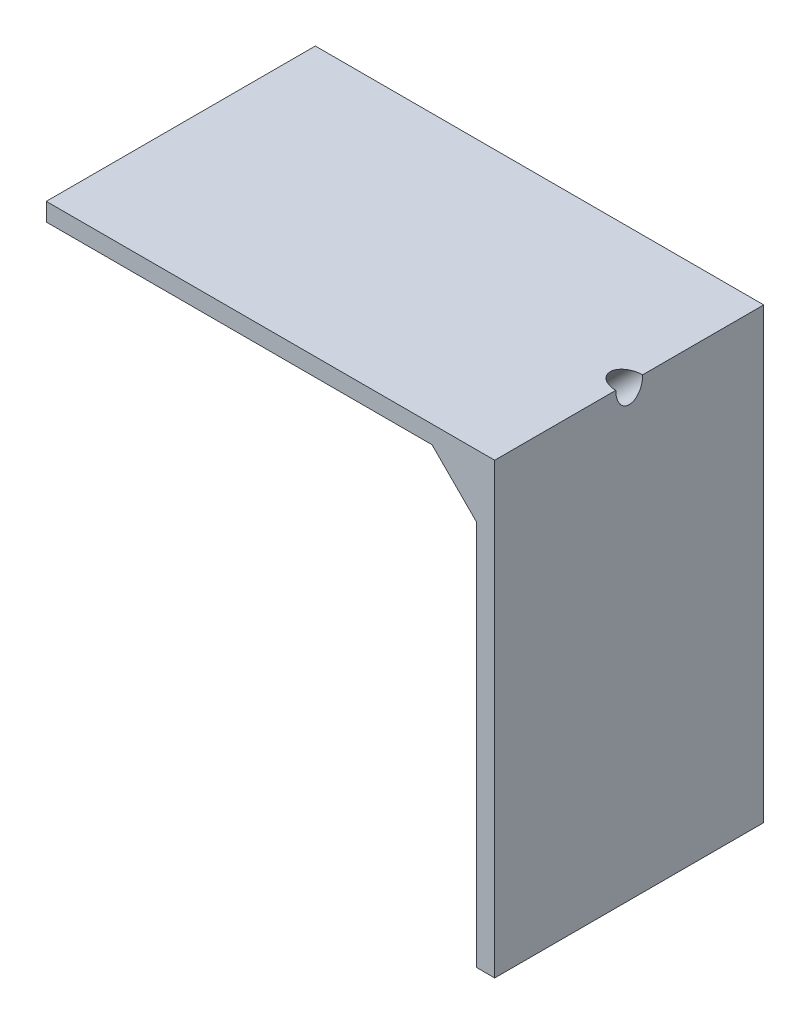
ISO-10303-21;
HEADER;
FILE_DESCRIPTION(('STEP AP214'),'2;1');
FILE_NAME('part.step','',(''),(''),'','','');
FILE_SCHEMA(('AUTOMOTIVE_DESIGN { 1 0 10303 214 1 1 1 1 }'));
ENDSEC;
DATA;
#1=APPLICATION_CONTEXT('core data for automotive mechanical design processes');
#2=APPLICATION_PROTOCOL_DEFINITION('international standard','automotive_design',2000,#1);
#3=PRODUCT_CONTEXT('',#1,'mechanical');
#4=PRODUCT('Part','Part','',(#3));
#5=PRODUCT_RELATED_PRODUCT_CATEGORY('part','',(#4));
#6=PRODUCT_DEFINITION_FORMATION('','',#4);
#7=PRODUCT_DEFINITION_CONTEXT('part definition',#1,'design');
#8=PRODUCT_DEFINITION('design','',#6,#7);
#9=PRODUCT_DEFINITION_SHAPE('','',#8);
#10=(LENGTH_UNIT() NAMED_UNIT(*) SI_UNIT(.MILLI.,.METRE.));
#11=(NAMED_UNIT(*) PLANE_ANGLE_UNIT() SI_UNIT($,.RADIAN.));
#12=(NAMED_UNIT(*) SI_UNIT($,.STERADIAN.) SOLID_ANGLE_UNIT());
#13=UNCERTAINTY_MEASURE_WITH_UNIT(LENGTH_MEASURE(1.E-05),#10,'distance_accuracy_value','');
#14=(GEOMETRIC_REPRESENTATION_CONTEXT(3) GLOBAL_UNCERTAINTY_ASSIGNED_CONTEXT((#13)) GLOBAL_UNIT_ASSIGNED_CONTEXT((#10,
#11,#12)) REPRESENTATION_CONTEXT('',''));
#15=CARTESIAN_POINT('',(0.,0.,0.));
#16=DIRECTION('',(0.,0.,1.));
#17=DIRECTION('',(1.,0.,0.));
#18=AXIS2_PLACEMENT_3D('',#15,#16,#17);
#19=CARTESIAN_POINT('',(0.,2.0833333333334,30.));
#20=DIRECTION('',(0.,1.,0.));
#21=DIRECTION('',(0.,0.,1.));
#22=AXIS2_PLACEMENT_3D('',#19,#20,#21);
#23=PLANE('',#22);
#24=DIRECTION('',(1.,0.,0.));
#25=VECTOR('',#24,1.);
#26=CARTESIAN_POINT('',(0.,2.0833333333334,0.));
#27=LINE('',#26,#25);
#28=CARTESIAN_POINT('',(-27.7951784358391,2.0833333333334,0.));
#29=VERTEX_POINT('',#28);
#30=CARTESIAN_POINT('',(15.2155330881563,2.0833333333334,0.));
#31=VERTEX_POINT('',#30);
#32=EDGE_CURVE('E163',#29,#31,#27,.T.);
#33=ORIENTED_EDGE('',*,*,#32,.T.);
#34=DIRECTION('',(0.,0.,1.));
#35=VECTOR('',#34,1.);
#36=CARTESIAN_POINT('',(15.2155330881563,2.0833333333334,0.));
#37=LINE('',#36,#35);
#38=CARTESIAN_POINT('',(15.2155330881563,2.0833333333334,30.));
#39=VERTEX_POINT('',#38);
#40=EDGE_CURVE('E228',#31,#39,#37,.T.);
#41=ORIENTED_EDGE('',*,*,#40,.T.);
#42=DIRECTION('',(1.,0.,0.));
#43=VECTOR('',#42,1.);
#44=CARTESIAN_POINT('',(0.,2.0833333333334,30.));
#45=LINE('',#44,#43);
#46=CARTESIAN_POINT('',(-27.7951784358391,2.0833333333334,30.));
#47=VERTEX_POINT('',#46);
#48=EDGE_CURVE('E161',#47,#39,#45,.T.);
#49=ORIENTED_EDGE('',*,*,#48,.F.);
#50=DIRECTION('',(0.,0.,-1.));
#51=VECTOR('',#50,1.);
#52=CARTESIAN_POINT('',(-27.7951784358391,2.0833333333334,30.));
#53=LINE('',#52,#51);
#54=EDGE_CURVE('E169',#47,#29,#53,.T.);
#55=ORIENTED_EDGE('',*,*,#54,.T.);
#56=EDGE_LOOP('',(#33,#41,#49,#55));
#57=FACE_BOUND('',#56,.T.);
#58=ADVANCED_FACE('F69',(#57),#23,.F.);
#59=CARTESIAN_POINT('',(22.2048215641609,0.,30.));
#60=DIRECTION('',(1.,0.,0.));
#61=DIRECTION('',(0.,0.,-1.));
#62=AXIS2_PLACEMENT_3D('',#59,#60,#61);
#63=PLANE('',#62);
#64=CARTESIAN_POINT('',(22.2048215641609,4.06587808688611,15.));
#65=DIRECTION('',(1.,0.,0.));
#66=DIRECTION('',(0.,-1.,0.));
#67=AXIS2_PLACEMENT_3D('',#64,#65,#66);
#68=ELLIPSE('',#67,2.11904930445503,1.5);
#69=CARTESIAN_POINT('',(22.2048215641609,4.0833333333334,16.4999491092938));
#70=VERTEX_POINT('',#69);
#71=CARTESIAN_POINT('',(22.2048215641609,4.0833333333334,13.5000508907062));
#72=VERTEX_POINT('',#71);
#73=EDGE_CURVE('E86',#70,#72,#68,.T.);
#74=ORIENTED_EDGE('',*,*,#73,.F.);
#75=DIRECTION('',(0.,0.,-1.));
#76=VECTOR('',#75,1.);
#77=CARTESIAN_POINT('',(22.2048215641609,4.0833333333334,30.));
#78=LINE('',#77,#76);
#79=CARTESIAN_POINT('',(22.2048215641609,4.0833333333334,30.));
#80=VERTEX_POINT('',#79);
#81=EDGE_CURVE('E12',#80,#70,#78,.T.);
#82=ORIENTED_EDGE('',*,*,#81,.F.);
#83=DIRECTION('',(0.,-1.,0.));
#84=VECTOR('',#83,1.);
#85=CARTESIAN_POINT('',(22.2048215641609,0.,30.));
#86=LINE('',#85,#84);
#87=CARTESIAN_POINT('',(22.2048215641609,-45.9166666666666,30.));
#88=VERTEX_POINT('',#87);
#89=EDGE_CURVE('E157',#80,#88,#86,.T.);
#90=ORIENTED_EDGE('',*,*,#89,.T.);
#91=DIRECTION('',(0.,0.,-1.));
#92=VECTOR('',#91,1.);
#93=CARTESIAN_POINT('',(22.2048215641609,-45.9166666666666,30.));
#94=LINE('',#93,#92);
#95=CARTESIAN_POINT('',(22.2048215641609,-45.9166666666666,0.));
#96=VERTEX_POINT('',#95);
#97=EDGE_CURVE('E196',#88,#96,#94,.T.);
#98=ORIENTED_EDGE('',*,*,#97,.T.);
#99=DIRECTION('',(0.,-1.,0.));
#100=VECTOR('',#99,1.);
#101=CARTESIAN_POINT('',(22.2048215641609,0.,0.));
#102=LINE('',#101,#100);
#103=CARTESIAN_POINT('',(22.2048215641609,4.0833333333334,0.));
#104=VERTEX_POINT('',#103);
#105=EDGE_CURVE('E170',#104,#96,#102,.T.);
#106=ORIENTED_EDGE('',*,*,#105,.F.);
#107=EDGE_CURVE('E79',#72,#104,#78,.T.);
#108=ORIENTED_EDGE('',*,*,#107,.F.);
#109=EDGE_LOOP('',(#74,#82,#90,#98,#106,#108));
#110=FACE_BOUND('',#109,.T.);
#111=ADVANCED_FACE('F143',(#110),#63,.T.);
#112=CARTESIAN_POINT('',(0.,4.0833333333334,30.));
#113=DIRECTION('',(0.,1.,0.));
#114=DIRECTION('',(-1.,0.,0.));
#115=AXIS2_PLACEMENT_3D('',#112,#113,#114);
#116=PLANE('',#115);
#117=CARTESIAN_POINT('',(22.2223142853488,4.0833333333334,15.));
#118=DIRECTION('',(0.,1.,0.));
#119=DIRECTION('',(-1.,0.,0.));
#120=AXIS2_PLACEMENT_3D('',#117,#118,#119);
#121=ELLIPSE('',#120,2.12359870014164,1.5);
#122=EDGE_CURVE('E134',#72,#70,#121,.T.);
#123=ORIENTED_EDGE('',*,*,#122,.F.);
#124=ORIENTED_EDGE('',*,*,#107,.T.);
#125=DIRECTION('',(1.,0.,0.));
#126=VECTOR('',#125,1.);
#127=CARTESIAN_POINT('',(0.,4.0833333333334,0.));
#128=LINE('',#127,#126);
#129=CARTESIAN_POINT('',(-27.7951784358391,4.0833333333334,0.));
#130=VERTEX_POINT('',#129);
#131=EDGE_CURVE('E173',#130,#104,#128,.T.);
#132=ORIENTED_EDGE('',*,*,#131,.F.);
#133=DIRECTION('',(0.,0.,-1.));
#134=VECTOR('',#133,1.);
#135=CARTESIAN_POINT('',(-27.7951784358391,4.0833333333334,30.));
#136=LINE('',#135,#134);
#137=CARTESIAN_POINT('',(-27.7951784358391,4.0833333333334,30.));
#138=VERTEX_POINT('',#137);
#139=EDGE_CURVE('E153',#138,#130,#136,.T.);
#140=ORIENTED_EDGE('',*,*,#139,.F.);
#141=DIRECTION('',(1.,0.,0.));
#142=VECTOR('',#141,1.);
#143=CARTESIAN_POINT('',(0.,4.0833333333334,30.));
#144=LINE('',#143,#142);
#145=EDGE_CURVE('E151',#138,#80,#144,.T.);
#146=ORIENTED_EDGE('',*,*,#145,.T.);
#147=ORIENTED_EDGE('',*,*,#81,.T.);
#148=EDGE_LOOP('',(#123,#124,#132,#140,#146,#147));
#149=FACE_BOUND('',#148,.T.);
#150=ADVANCED_FACE('F149',(#149),#116,.T.);
#151=CARTESIAN_POINT('',(-27.7951784358391,0.,30.));
#152=DIRECTION('',(1.,0.,0.));
#153=DIRECTION('',(0.,0.,-1.));
#154=AXIS2_PLACEMENT_3D('',#151,#152,#153);
#155=PLANE('',#154);
#156=DIRECTION('',(0.,-1.,0.));
#157=VECTOR('',#156,1.);
#158=CARTESIAN_POINT('',(-27.7951784358391,0.,0.));
#159=LINE('',#158,#157);
#160=EDGE_CURVE('E177',#130,#29,#159,.T.);
#161=ORIENTED_EDGE('',*,*,#160,.T.);
#162=ORIENTED_EDGE('',*,*,#54,.F.);
#163=DIRECTION('',(0.,-1.,0.));
#164=VECTOR('',#163,1.);
#165=CARTESIAN_POINT('',(-27.7951784358391,0.,30.));
#166=LINE('',#165,#164);
#167=EDGE_CURVE('E156',#138,#47,#166,.T.);
#168=ORIENTED_EDGE('',*,*,#167,.F.);
#169=ORIENTED_EDGE('',*,*,#139,.T.);
#170=EDGE_LOOP('',(#161,#162,#168,#169));
#171=FACE_BOUND('',#170,.T.);
#172=ADVANCED_FACE('F224',(#171),#155,.F.);
#173=CARTESIAN_POINT('',(0.,0.,30.));
#174=DIRECTION('',(0.,0.,1.));
#175=DIRECTION('',(1.,0.,0.));
#176=AXIS2_PLACEMENT_3D('',#173,#174,#175);
#177=PLANE('',#176);
#178=ORIENTED_EDGE('',*,*,#48,.T.);
#179=DIRECTION('',(0.706348143790044,-0.707864605531566,0.));
#180=VECTOR('',#179,1.);
#181=CARTESIAN_POINT('',(15.2155330881563,2.0833333333334,30.));
#182=LINE('',#181,#180);
#183=CARTESIAN_POINT('',(20.2048215641609,-2.9166666666666,30.));
#184=VERTEX_POINT('',#183);
#185=EDGE_CURVE('E94',#39,#184,#182,.T.);
#186=ORIENTED_EDGE('',*,*,#185,.T.);
#187=DIRECTION('',(0.,-1.,0.));
#188=VECTOR('',#187,1.);
#189=CARTESIAN_POINT('',(20.2048215641609,2.0833333333334,30.));
#190=LINE('',#189,#188);
#191=CARTESIAN_POINT('',(20.2048215641609,-45.9166666666666,30.));
#192=VERTEX_POINT('',#191);
#193=EDGE_CURVE('E188',#184,#192,#190,.T.);
#194=ORIENTED_EDGE('',*,*,#193,.T.);
#195=DIRECTION('',(-1.,0.,0.));
#196=VECTOR('',#195,1.);
#197=CARTESIAN_POINT('',(22.2048215641609,-45.9166666666666,30.));
#198=LINE('',#197,#196);
#199=EDGE_CURVE('E191',#88,#192,#198,.T.);
#200=ORIENTED_EDGE('',*,*,#199,.F.);
#201=ORIENTED_EDGE('',*,*,#89,.F.);
#202=ORIENTED_EDGE('',*,*,#145,.F.);
#203=ORIENTED_EDGE('',*,*,#167,.T.);
#204=EDGE_LOOP('',(#178,#186,#194,#200,#201,#202,#203));
#205=FACE_BOUND('',#204,.T.);
#206=ADVANCED_FACE('F229',(#205),#177,.T.);
#207=CARTESIAN_POINT('',(0.,0.,0.));
#208=DIRECTION('',(0.,0.,1.));
#209=DIRECTION('',(1.,0.,0.));
#210=AXIS2_PLACEMENT_3D('',#207,#208,#209);
#211=PLANE('',#210);
#212=DIRECTION('',(0.706348143790044,-0.707864605531566,0.));
#213=VECTOR('',#212,1.);
#214=CARTESIAN_POINT('',(15.2155330881563,2.0833333333334,0.));
#215=LINE('',#214,#213);
#216=CARTESIAN_POINT('',(20.2048215641609,-2.9166666666666,0.));
#217=VERTEX_POINT('',#216);
#218=EDGE_CURVE('E253',#31,#217,#215,.T.);
#219=ORIENTED_EDGE('',*,*,#218,.F.);
#220=ORIENTED_EDGE('',*,*,#32,.F.);
#221=ORIENTED_EDGE('',*,*,#160,.F.);
#222=ORIENTED_EDGE('',*,*,#131,.T.);
#223=ORIENTED_EDGE('',*,*,#105,.T.);
#224=DIRECTION('',(-1.,0.,0.));
#225=VECTOR('',#224,1.);
#226=CARTESIAN_POINT('',(22.2048215641609,-45.9166666666666,0.));
#227=LINE('',#226,#225);
#228=CARTESIAN_POINT('',(20.2048215641609,-45.9166666666666,0.));
#229=VERTEX_POINT('',#228);
#230=EDGE_CURVE('E192',#96,#229,#227,.T.);
#231=ORIENTED_EDGE('',*,*,#230,.T.);
#232=DIRECTION('',(0.,-1.,0.));
#233=VECTOR('',#232,1.);
#234=CARTESIAN_POINT('',(20.2048215641609,2.0833333333334,0.));
#235=LINE('',#234,#233);
#236=EDGE_CURVE('E197',#217,#229,#235,.T.);
#237=ORIENTED_EDGE('',*,*,#236,.F.);
#238=EDGE_LOOP('',(#219,#220,#221,#222,#223,#231,#237));
#239=FACE_BOUND('',#238,.T.);
#240=ADVANCED_FACE('F218',(#239),#211,.F.);
#241=CARTESIAN_POINT('',(22.2048215641609,-45.9166666666666,30.));
#242=DIRECTION('',(0.,-1.,0.));
#243=DIRECTION('',(0.,0.,-1.));
#244=AXIS2_PLACEMENT_3D('',#241,#242,#243);
#245=PLANE('',#244);
#246=ORIENTED_EDGE('',*,*,#230,.F.);
#247=ORIENTED_EDGE('',*,*,#97,.F.);
#248=ORIENTED_EDGE('',*,*,#199,.T.);
#249=DIRECTION('',(0.,0.,-1.));
#250=VECTOR('',#249,1.);
#251=CARTESIAN_POINT('',(20.2048215641609,-45.9166666666666,30.));
#252=LINE('',#251,#250);
#253=EDGE_CURVE('E73',#192,#229,#252,.T.);
#254=ORIENTED_EDGE('',*,*,#253,.T.);
#255=EDGE_LOOP('',(#246,#247,#248,#254));
#256=FACE_BOUND('',#255,.T.);
#257=ADVANCED_FACE('F211',(#256),#245,.T.);
#258=CARTESIAN_POINT('',(20.2048215641609,2.0833333333334,30.));
#259=DIRECTION('',(1.,0.,0.));
#260=DIRECTION('',(0.,0.,-1.));
#261=AXIS2_PLACEMENT_3D('',#258,#259,#260);
#262=PLANE('',#261);
#263=ORIENTED_EDGE('',*,*,#193,.F.);
#264=DIRECTION('',(0.,0.,1.));
#265=VECTOR('',#264,1.);
#266=CARTESIAN_POINT('',(20.2048215641609,-2.9166666666666,0.));
#267=LINE('',#266,#265);
#268=EDGE_CURVE('E200',#217,#184,#267,.T.);
#269=ORIENTED_EDGE('',*,*,#268,.F.);
#270=ORIENTED_EDGE('',*,*,#236,.T.);
#271=ORIENTED_EDGE('',*,*,#253,.F.);
#272=EDGE_LOOP('',(#263,#269,#270,#271));
#273=FACE_BOUND('',#272,.T.);
#274=ADVANCED_FACE('F71',(#273),#262,.F.);
#275=CARTESIAN_POINT('',(15.2155330881563,2.0833333333334,0.));
#276=DIRECTION('',(-0.707864605531566,-0.706348143790044,0.));
#277=DIRECTION('',(0.706348143790044,-0.707864605531566,0.));
#278=AXIS2_PLACEMENT_3D('',#275,#276,#277);
#279=PLANE('',#278);
#280=CARTESIAN_POINT('',(17.7114126165821,-0.417904609140169,15.));
#281=DIRECTION('',(-0.707864605531566,-0.706348143790044,0.));
#282=DIRECTION('',(0.706348143790044,-0.707864605531566,0.));
#283=AXIS2_PLACEMENT_3D('',#280,#281,#282);
#284=CIRCLE('',#283,1.5);
#285=CARTESIAN_POINT('',(18.7709348322671,-1.47970151743752,15.));
#286=VERTEX_POINT('',#285);
#287=EDGE_CURVE('E140',#286,#286,#284,.T.);
#288=ORIENTED_EDGE('',*,*,#287,.F.);
#289=EDGE_LOOP('',(#288));
#290=FACE_BOUND('',#289,.T.);
#291=ORIENTED_EDGE('',*,*,#185,.F.);
#292=ORIENTED_EDGE('',*,*,#40,.F.);
#293=ORIENTED_EDGE('',*,*,#218,.T.);
#294=ORIENTED_EDGE('',*,*,#268,.T.);
#295=EDGE_LOOP('',(#291,#292,#293,#294));
#296=FACE_BOUND('',#295,.T.);
#297=ADVANCED_FACE('F237',(#290,#296),#279,.T.);
#298=CARTESIAN_POINT('',(38.947350782529,20.7725397045612,15.));
#299=DIRECTION('',(-0.707864605531566,-0.706348143790044,0.));
#300=DIRECTION('',(0.706348143790044,-0.707864605531566,0.));
#301=AXIS2_PLACEMENT_3D('',#298,#299,#300);
#302=CYLINDRICAL_SURFACE('',#301,1.5);
#303=ORIENTED_EDGE('',*,*,#73,.T.);
#304=ORIENTED_EDGE('',*,*,#122,.T.);
#305=EDGE_LOOP('',(#303,#304));
#306=FACE_BOUND('',#305,.T.);
#307=ORIENTED_EDGE('',*,*,#287,.T.);
#308=EDGE_LOOP('',(#307));
#309=FACE_BOUND('',#308,.T.);
#310=ADVANCED_FACE('F135',(#306,#309),#302,.F.);
#311=CLOSED_SHELL('',(#58,#111,#150,#172,#206,#240,#257,#274,#297,#310));
#312=MANIFOLD_SOLID_BREP('B2',#311);
#313=ADVANCED_BREP_SHAPE_REPRESENTATION('',(#18,#312),#14);
#314=SHAPE_DEFINITION_REPRESENTATION(#9,#313);
ENDSEC;
END-ISO-10303-21;
